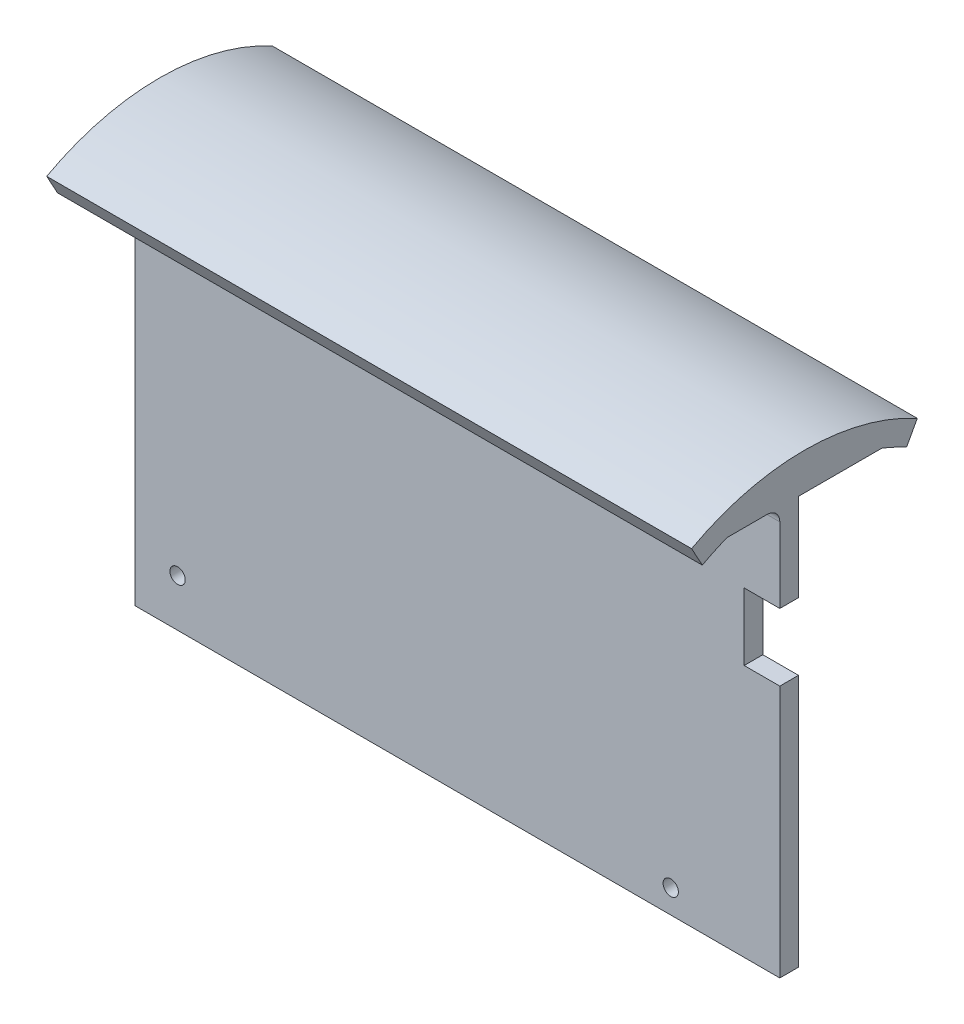
ISO-10303-21;
HEADER;
FILE_DESCRIPTION(('STEP AP214'),'2;1');
FILE_NAME('part.step','',(''),(''),'','','');
FILE_SCHEMA(('AUTOMOTIVE_DESIGN { 1 0 10303 214 1 1 1 1 }'));
ENDSEC;
DATA;
#1=APPLICATION_CONTEXT('core data for automotive mechanical design processes');
#2=APPLICATION_PROTOCOL_DEFINITION('international standard','automotive_design',2000,#1);
#3=PRODUCT_CONTEXT('',#1,'mechanical');
#4=PRODUCT('Part','Part','',(#3));
#5=PRODUCT_RELATED_PRODUCT_CATEGORY('part','',(#4));
#6=PRODUCT_DEFINITION_FORMATION('','',#4);
#7=PRODUCT_DEFINITION_CONTEXT('part definition',#1,'design');
#8=PRODUCT_DEFINITION('design','',#6,#7);
#9=PRODUCT_DEFINITION_SHAPE('','',#8);
#10=(LENGTH_UNIT() NAMED_UNIT(*) SI_UNIT(.MILLI.,.METRE.));
#11=(NAMED_UNIT(*) PLANE_ANGLE_UNIT() SI_UNIT($,.RADIAN.));
#12=(NAMED_UNIT(*) SI_UNIT($,.STERADIAN.) SOLID_ANGLE_UNIT());
#13=UNCERTAINTY_MEASURE_WITH_UNIT(LENGTH_MEASURE(1.E-05),#10,'distance_accuracy_value','');
#14=(GEOMETRIC_REPRESENTATION_CONTEXT(3) GLOBAL_UNCERTAINTY_ASSIGNED_CONTEXT((#13)) GLOBAL_UNIT_ASSIGNED_CONTEXT((#10,
#11,#12)) REPRESENTATION_CONTEXT('',''));
#15=CARTESIAN_POINT('',(0.,0.,0.));
#16=DIRECTION('',(0.,0.,1.));
#17=DIRECTION('',(1.,0.,0.));
#18=AXIS2_PLACEMENT_3D('',#15,#16,#17);
#19=CARTESIAN_POINT('',(0.,-28.0599447093199,2.5));
#20=DIRECTION('',(0.,-1.,0.));
#21=DIRECTION('',(0.,0.,-1.));
#22=AXIS2_PLACEMENT_3D('',#19,#20,#21);
#23=PLANE('',#22);
#24=DIRECTION('',(-1.,0.,0.));
#25=VECTOR('',#24,1.);
#26=CARTESIAN_POINT('',(0.,-28.0599447093199,0.));
#27=LINE('',#26,#25);
#28=CARTESIAN_POINT('',(43.18,-28.0599447093199,0.));
#29=VERTEX_POINT('',#28);
#30=CARTESIAN_POINT('',(-43.18,-28.0599447093199,0.));
#31=VERTEX_POINT('',#30);
#32=EDGE_CURVE('E338',#29,#31,#27,.T.);
#33=ORIENTED_EDGE('',*,*,#32,.F.);
#34=DIRECTION('',(0.,0.,-1.));
#35=VECTOR('',#34,1.);
#36=CARTESIAN_POINT('',(43.18,-28.0599447093199,2.5));
#37=LINE('',#36,#35);
#38=CARTESIAN_POINT('',(43.18,-28.0599447093199,2.5));
#39=VERTEX_POINT('',#38);
#40=EDGE_CURVE('E382',#39,#29,#37,.T.);
#41=ORIENTED_EDGE('',*,*,#40,.F.);
#42=DIRECTION('',(-1.,0.,0.));
#43=VECTOR('',#42,1.);
#44=CARTESIAN_POINT('',(0.,-28.0599447093199,2.5));
#45=LINE('',#44,#43);
#46=CARTESIAN_POINT('',(-43.18,-28.0599447093199,2.5));
#47=VERTEX_POINT('',#46);
#48=EDGE_CURVE('E302',#39,#47,#45,.T.);
#49=ORIENTED_EDGE('',*,*,#48,.T.);
#50=DIRECTION('',(0.,0.,-1.));
#51=VECTOR('',#50,1.);
#52=CARTESIAN_POINT('',(-43.18,-28.0599447093199,2.5));
#53=LINE('',#52,#51);
#54=EDGE_CURVE('E326',#47,#31,#53,.T.);
#55=ORIENTED_EDGE('',*,*,#54,.T.);
#56=EDGE_LOOP('',(#33,#41,#49,#55));
#57=FACE_BOUND('',#56,.T.);
#58=ADVANCED_FACE('F41',(#57),#23,.T.);
#59=CARTESIAN_POINT('',(43.18,0.,2.5));
#60=DIRECTION('',(1.,0.,0.));
#61=DIRECTION('',(0.,0.,-1.));
#62=AXIS2_PLACEMENT_3D('',#59,#60,#61);
#63=PLANE('',#62);
#64=DIRECTION('',(0.,-1.,0.));
#65=VECTOR('',#64,1.);
#66=CARTESIAN_POINT('',(43.18,0.,0.));
#67=LINE('',#66,#65);
#68=CARTESIAN_POINT('',(43.18,5.7940552906801,0.));
#69=VERTEX_POINT('',#68);
#70=EDGE_CURVE('E342',#69,#29,#67,.T.);
#71=ORIENTED_EDGE('',*,*,#70,.F.);
#72=DIRECTION('',(0.,0.,-1.));
#73=VECTOR('',#72,1.);
#74=CARTESIAN_POINT('',(43.18,5.7940552906801,2.5));
#75=LINE('',#74,#73);
#76=CARTESIAN_POINT('',(43.18,5.7940552906801,2.5));
#77=VERTEX_POINT('',#76);
#78=EDGE_CURVE('E379',#77,#69,#75,.T.);
#79=ORIENTED_EDGE('',*,*,#78,.F.);
#80=DIRECTION('',(0.,-1.,0.));
#81=VECTOR('',#80,1.);
#82=CARTESIAN_POINT('',(43.18,0.,2.5));
#83=LINE('',#82,#81);
#84=EDGE_CURVE('E306',#77,#39,#83,.T.);
#85=ORIENTED_EDGE('',*,*,#84,.T.);
#86=ORIENTED_EDGE('',*,*,#40,.T.);
#87=EDGE_LOOP('',(#71,#79,#85,#86));
#88=FACE_BOUND('',#87,.T.);
#89=ADVANCED_FACE('F516',(#88),#63,.T.);
#90=CARTESIAN_POINT('',(0.,5.7940552906801,2.5));
#91=DIRECTION('',(0.,1.,0.));
#92=DIRECTION('',(0.,0.,1.));
#93=AXIS2_PLACEMENT_3D('',#90,#91,#92);
#94=PLANE('',#93);
#95=DIRECTION('',(1.,0.,0.));
#96=VECTOR('',#95,1.);
#97=CARTESIAN_POINT('',(0.,5.7940552906801,0.));
#98=LINE('',#97,#96);
#99=CARTESIAN_POINT('',(38.4076827239981,5.7940552906801,0.));
#100=VERTEX_POINT('',#99);
#101=EDGE_CURVE('E346',#100,#69,#98,.T.);
#102=ORIENTED_EDGE('',*,*,#101,.F.);
#103=DIRECTION('',(0.,0.,-1.));
#104=VECTOR('',#103,1.);
#105=CARTESIAN_POINT('',(38.4076827239981,5.7940552906801,2.5));
#106=LINE('',#105,#104);
#107=CARTESIAN_POINT('',(38.4076827239981,5.7940552906801,2.5));
#108=VERTEX_POINT('',#107);
#109=EDGE_CURVE('E376',#108,#100,#106,.T.);
#110=ORIENTED_EDGE('',*,*,#109,.F.);
#111=DIRECTION('',(1.,0.,0.));
#112=VECTOR('',#111,1.);
#113=CARTESIAN_POINT('',(0.,5.7940552906801,2.5));
#114=LINE('',#113,#112);
#115=EDGE_CURVE('E310',#108,#77,#114,.T.);
#116=ORIENTED_EDGE('',*,*,#115,.T.);
#117=ORIENTED_EDGE('',*,*,#78,.T.);
#118=EDGE_LOOP('',(#102,#110,#116,#117));
#119=FACE_BOUND('',#118,.T.);
#120=ADVANCED_FACE('F520',(#119),#94,.T.);
#121=CARTESIAN_POINT('',(38.4076827239981,0.,2.5));
#122=DIRECTION('',(1.,0.,0.));
#123=DIRECTION('',(0.,0.,-1.));
#124=AXIS2_PLACEMENT_3D('',#121,#122,#123);
#125=PLANE('',#124);
#126=DIRECTION('',(0.,-1.,0.));
#127=VECTOR('',#126,1.);
#128=CARTESIAN_POINT('',(38.4076827239981,0.,0.));
#129=LINE('',#128,#127);
#130=CARTESIAN_POINT('',(38.4076827239981,14.7940552906801,0.));
#131=VERTEX_POINT('',#130);
#132=EDGE_CURVE('E350',#131,#100,#129,.T.);
#133=ORIENTED_EDGE('',*,*,#132,.F.);
#134=DIRECTION('',(0.,0.,-1.));
#135=VECTOR('',#134,1.);
#136=CARTESIAN_POINT('',(38.4076827239981,14.7940552906801,2.5));
#137=LINE('',#136,#135);
#138=CARTESIAN_POINT('',(38.4076827239981,14.7940552906801,2.5));
#139=VERTEX_POINT('',#138);
#140=EDGE_CURVE('E373',#139,#131,#137,.T.);
#141=ORIENTED_EDGE('',*,*,#140,.F.);
#142=DIRECTION('',(0.,-1.,0.));
#143=VECTOR('',#142,1.);
#144=CARTESIAN_POINT('',(38.4076827239981,0.,2.5));
#145=LINE('',#144,#143);
#146=EDGE_CURVE('E314',#139,#108,#145,.T.);
#147=ORIENTED_EDGE('',*,*,#146,.T.);
#148=ORIENTED_EDGE('',*,*,#109,.T.);
#149=EDGE_LOOP('',(#133,#141,#147,#148));
#150=FACE_BOUND('',#149,.T.);
#151=ADVANCED_FACE('F526',(#150),#125,.T.);
#152=CARTESIAN_POINT('',(0.,14.7940552906801,2.5));
#153=DIRECTION('',(0.,-1.,0.));
#154=DIRECTION('',(0.,0.,-1.));
#155=AXIS2_PLACEMENT_3D('',#152,#153,#154);
#156=PLANE('',#155);
#157=DIRECTION('',(-1.,0.,0.));
#158=VECTOR('',#157,1.);
#159=CARTESIAN_POINT('',(0.,14.7940552906801,0.));
#160=LINE('',#159,#158);
#161=CARTESIAN_POINT('',(43.18,14.7940552906801,0.));
#162=VERTEX_POINT('',#161);
#163=EDGE_CURVE('E354',#162,#131,#160,.T.);
#164=ORIENTED_EDGE('',*,*,#163,.F.);
#165=DIRECTION('',(0.,0.,-1.));
#166=VECTOR('',#165,1.);
#167=CARTESIAN_POINT('',(43.18,14.7940552906801,2.5));
#168=LINE('',#167,#166);
#169=CARTESIAN_POINT('',(43.18,14.7940552906801,2.5));
#170=VERTEX_POINT('',#169);
#171=EDGE_CURVE('E370',#170,#162,#168,.T.);
#172=ORIENTED_EDGE('',*,*,#171,.F.);
#173=DIRECTION('',(-1.,0.,0.));
#174=VECTOR('',#173,1.);
#175=CARTESIAN_POINT('',(0.,14.7940552906801,2.5));
#176=LINE('',#175,#174);
#177=EDGE_CURVE('E318',#170,#139,#176,.T.);
#178=ORIENTED_EDGE('',*,*,#177,.T.);
#179=ORIENTED_EDGE('',*,*,#140,.T.);
#180=EDGE_LOOP('',(#164,#172,#178,#179));
#181=FACE_BOUND('',#180,.T.);
#182=ADVANCED_FACE('F512',(#181),#156,.T.);
#183=CARTESIAN_POINT('',(43.18,0.,2.5));
#184=DIRECTION('',(-1.,0.,0.));
#185=DIRECTION('',(0.,0.,1.));
#186=AXIS2_PLACEMENT_3D('',#183,#184,#185);
#187=PLANE('',#186);
#188=DIRECTION('',(0.,1.,0.));
#189=VECTOR('',#188,1.);
#190=CARTESIAN_POINT('',(43.18,0.,0.));
#191=LINE('',#190,#189);
#192=CARTESIAN_POINT('',(43.18,26.5500552906801,0.));
#193=VERTEX_POINT('',#192);
#194=EDGE_CURVE('E358',#162,#193,#191,.T.);
#195=ORIENTED_EDGE('',*,*,#194,.T.);
#196=DIRECTION('',(0.,0.,-1.));
#197=VECTOR('',#196,1.);
#198=CARTESIAN_POINT('',(43.18,26.5500552906801,0.));
#199=LINE('',#198,#197);
#200=CARTESIAN_POINT('',(43.18,26.5500552906801,-11.1607221785853));
#201=VERTEX_POINT('',#200);
#202=EDGE_CURVE('E424',#193,#201,#199,.T.);
#203=ORIENTED_EDGE('',*,*,#202,.T.);
#204=CARTESIAN_POINT('',(43.18,0.,-0.799999999999999));
#205=DIRECTION('',(-1.,0.,0.));
#206=DIRECTION('',(0.,0.,1.));
#207=AXIS2_PLACEMENT_3D('',#204,#205,#206);
#208=CIRCLE('',#207,28.5);
#209=CARTESIAN_POINT('',(43.18,25.0057478849418,-14.4734257856153));
#210=VERTEX_POINT('',#209);
#211=EDGE_CURVE('E426',#201,#210,#208,.T.);
#212=ORIENTED_EDGE('',*,*,#211,.T.);
#213=DIRECTION('',(0.,-0.877394662629536,0.479769325811064));
#214=VECTOR('',#213,1.);
#215=CARTESIAN_POINT('',(43.18,25.0057478849418,-14.4734257856153));
#216=LINE('',#215,#214);
#217=CARTESIAN_POINT('',(43.18,27.6379318728304,-15.9127337630485));
#218=VERTEX_POINT('',#217);
#219=EDGE_CURVE('E428',#218,#210,#216,.T.);
#220=ORIENTED_EDGE('',*,*,#219,.F.);
#221=CARTESIAN_POINT('',(43.18,0.,-0.799999999999999));
#222=DIRECTION('',(-1.,0.,0.));
#223=DIRECTION('',(0.,0.,1.));
#224=AXIS2_PLACEMENT_3D('',#221,#222,#223);
#225=CIRCLE('',#224,31.5);
#226=CARTESIAN_POINT('',(43.18,27.6379318728304,14.3127337630485));
#227=VERTEX_POINT('',#226);
#228=EDGE_CURVE('E432',#227,#218,#225,.T.);
#229=ORIENTED_EDGE('',*,*,#228,.F.);
#230=DIRECTION('',(0.,-0.877394662629537,-0.479769325811062));
#231=VECTOR('',#230,1.);
#232=CARTESIAN_POINT('',(43.18,25.0057478849418,12.8734257856153));
#233=LINE('',#232,#231);
#234=CARTESIAN_POINT('',(43.18,25.0057478849418,12.8734257856153));
#235=VERTEX_POINT('',#234);
#236=EDGE_CURVE('E436',#227,#235,#233,.T.);
#237=ORIENTED_EDGE('',*,*,#236,.T.);
#238=CARTESIAN_POINT('',(43.18,0.,-0.799999999999999));
#239=DIRECTION('',(-1.,0.,0.));
#240=DIRECTION('',(0.,0.,1.));
#241=AXIS2_PLACEMENT_3D('',#238,#239,#240);
#242=CIRCLE('',#241,28.5);
#243=CARTESIAN_POINT('',(43.18,26.5500552906801,9.56072217858534));
#244=VERTEX_POINT('',#243);
#245=EDGE_CURVE('E215',#235,#244,#242,.T.);
#246=ORIENTED_EDGE('',*,*,#245,.T.);
#247=DIRECTION('',(0.,0.,-1.));
#248=VECTOR('',#247,1.);
#249=CARTESIAN_POINT('',(43.18,26.5500552906801,4.21341298725375));
#250=LINE('',#249,#248);
#251=CARTESIAN_POINT('',(43.18,26.5500552906801,4.21341298725375));
#252=VERTEX_POINT('',#251);
#253=EDGE_CURVE('E235',#244,#252,#250,.T.);
#254=ORIENTED_EDGE('',*,*,#253,.T.);
#255=CARTESIAN_POINT('',(43.18,24.8366423034263,4.21341298725375));
#256=DIRECTION('',(-1.,0.,0.));
#257=DIRECTION('',(0.,0.,1.));
#258=AXIS2_PLACEMENT_3D('',#255,#256,#257);
#259=CIRCLE('',#258,1.71341298725375);
#260=CARTESIAN_POINT('',(43.18,24.8366423034263,2.5));
#261=VERTEX_POINT('',#260);
#262=EDGE_CURVE('E167',#252,#261,#259,.T.);
#263=ORIENTED_EDGE('',*,*,#262,.T.);
#264=DIRECTION('',(0.,1.,0.));
#265=VECTOR('',#264,1.);
#266=CARTESIAN_POINT('',(43.18,0.,2.5));
#267=LINE('',#266,#265);
#268=EDGE_CURVE('E62',#170,#261,#267,.T.);
#269=ORIENTED_EDGE('',*,*,#268,.F.);
#270=ORIENTED_EDGE('',*,*,#171,.T.);
#271=EDGE_LOOP('',(#195,#203,#212,#220,#229,#237,#246,#254,#263,#269,#270));
#272=FACE_BOUND('',#271,.T.);
#273=ADVANCED_FACE('F443',(#272),#187,.F.);
#274=CARTESIAN_POINT('',(-18.3229245792443,20.4872418977798,2.5));
#275=DIRECTION('',(0.,0.,-1.));
#276=DIRECTION('',(-1.,0.,0.));
#277=AXIS2_PLACEMENT_3D('',#274,#275,#276);
#278=CYLINDRICAL_SURFACE('',#277,5.00000000000002);
#279=CARTESIAN_POINT('',(-18.3229245792443,20.4872418977798,2.5));
#280=DIRECTION('',(0.,0.,1.));
#281=DIRECTION('',(1.,0.,0.));
#282=AXIS2_PLACEMENT_3D('',#279,#280,#281);
#283=CIRCLE('',#282,5.00000000000002);
#284=CARTESIAN_POINT('',(-15.8566082752472,24.8366423034263,2.5));
#285=VERTEX_POINT('',#284);
#286=CARTESIAN_POINT('',(-20.7892408832413,24.8366423034263,2.5));
#287=VERTEX_POINT('',#286);
#288=EDGE_CURVE('E298',#285,#287,#283,.T.);
#289=ORIENTED_EDGE('',*,*,#288,.T.);
#290=EDGE_CURVE('E297',#287,#285,#283,.T.);
#291=ORIENTED_EDGE('',*,*,#290,.T.);
#292=EDGE_LOOP('',(#289,#291));
#293=FACE_BOUND('',#292,.T.);
#294=CARTESIAN_POINT('',(-18.3229245792443,20.4872418977798,0.));
#295=DIRECTION('',(0.,0.,1.));
#296=DIRECTION('',(1.,0.,0.));
#297=AXIS2_PLACEMENT_3D('',#294,#295,#296);
#298=CIRCLE('',#297,5.00000000000002);
#299=CARTESIAN_POINT('',(-13.3229245792442,20.4872418977798,0.));
#300=VERTEX_POINT('',#299);
#301=EDGE_CURVE('E334',#300,#300,#298,.T.);
#302=ORIENTED_EDGE('',*,*,#301,.F.);
#303=EDGE_LOOP('',(#302));
#304=FACE_BOUND('',#303,.T.);
#305=ADVANCED_FACE('F417',(#293,#304),#278,.F.);
#306=CARTESIAN_POINT('',(-4.22756625500798,21.4060553914884,2.5));
#307=DIRECTION('',(0.,0.,-1.));
#308=DIRECTION('',(-1.,0.,0.));
#309=AXIS2_PLACEMENT_3D('',#306,#307,#308);
#310=CYLINDRICAL_SURFACE('',#309,3.99999999999999);
#311=CARTESIAN_POINT('',(-4.22756625500798,21.4060553914884,2.5));
#312=DIRECTION('',(0.,0.,1.));
#313=DIRECTION('',(1.,0.,0.));
#314=AXIS2_PLACEMENT_3D('',#311,#312,#313);
#315=CIRCLE('',#314,3.99999999999999);
#316=CARTESIAN_POINT('',(-2.17060892933492,24.8366423034263,2.5));
#317=VERTEX_POINT('',#316);
#318=CARTESIAN_POINT('',(-6.28452358068103,24.8366423034263,2.5));
#319=VERTEX_POINT('',#318);
#320=EDGE_CURVE('E293',#317,#319,#315,.T.);
#321=ORIENTED_EDGE('',*,*,#320,.T.);
#322=EDGE_CURVE('E291',#319,#317,#315,.T.);
#323=ORIENTED_EDGE('',*,*,#322,.T.);
#324=EDGE_LOOP('',(#321,#323));
#325=FACE_BOUND('',#324,.T.);
#326=CARTESIAN_POINT('',(-4.22756625500798,21.4060553914884,0.));
#327=DIRECTION('',(0.,0.,1.));
#328=DIRECTION('',(1.,0.,0.));
#329=AXIS2_PLACEMENT_3D('',#326,#327,#328);
#330=CIRCLE('',#329,3.99999999999999);
#331=CARTESIAN_POINT('',(-0.227566255007983,21.4060553914884,0.));
#332=VERTEX_POINT('',#331);
#333=EDGE_CURVE('E330',#332,#332,#330,.T.);
#334=ORIENTED_EDGE('',*,*,#333,.F.);
#335=EDGE_LOOP('',(#334));
#336=FACE_BOUND('',#335,.T.);
#337=ADVANCED_FACE('F494',(#325,#336),#310,.F.);
#338=CARTESIAN_POINT('',(20.844433744992,18.8790553914884,2.5));
#339=DIRECTION('',(0.,0.,-1.));
#340=DIRECTION('',(-1.,0.,0.));
#341=AXIS2_PLACEMENT_3D('',#338,#339,#340);
#342=CYLINDRICAL_SURFACE('',#341,3.99999999999999);
#343=CARTESIAN_POINT('',(20.844433744992,18.8790553914884,2.5));
#344=DIRECTION('',(0.,0.,1.));
#345=DIRECTION('',(1.,0.,0.));
#346=AXIS2_PLACEMENT_3D('',#343,#344,#345);
#347=CIRCLE('',#346,3.99999999999999);
#348=CARTESIAN_POINT('',(24.844433744992,18.8790553914884,2.5));
#349=VERTEX_POINT('',#348);
#350=EDGE_CURVE('E287',#349,#349,#347,.T.);
#351=ORIENTED_EDGE('',*,*,#350,.T.);
#352=EDGE_LOOP('',(#351));
#353=FACE_BOUND('',#352,.T.);
#354=CARTESIAN_POINT('',(20.844433744992,18.8790553914884,0.));
#355=DIRECTION('',(0.,0.,1.));
#356=DIRECTION('',(1.,0.,0.));
#357=AXIS2_PLACEMENT_3D('',#354,#355,#356);
#358=CIRCLE('',#357,3.99999999999999);
#359=CARTESIAN_POINT('',(24.844433744992,18.8790553914884,0.));
#360=VERTEX_POINT('',#359);
#361=EDGE_CURVE('E286',#360,#360,#358,.T.);
#362=ORIENTED_EDGE('',*,*,#361,.F.);
#363=EDGE_LOOP('',(#362));
#364=FACE_BOUND('',#363,.T.);
#365=ADVANCED_FACE('F43',(#353,#364),#342,.F.);
#366=CARTESIAN_POINT('',(-43.18,0.,2.5));
#367=DIRECTION('',(-1.,0.,0.));
#368=DIRECTION('',(0.,0.,1.));
#369=AXIS2_PLACEMENT_3D('',#366,#367,#368);
#370=PLANE('',#369);
#371=DIRECTION('',(0.,0.,1.));
#372=VECTOR('',#371,1.);
#373=CARTESIAN_POINT('',(-43.18,26.5500552906801,0.));
#374=LINE('',#373,#372);
#375=CARTESIAN_POINT('',(-43.18,26.5500552906801,-11.1607221785853));
#376=VERTEX_POINT('',#375);
#377=CARTESIAN_POINT('',(-43.18,26.5500552906801,0.));
#378=VERTEX_POINT('',#377);
#379=EDGE_CURVE('E172',#376,#378,#374,.T.);
#380=ORIENTED_EDGE('',*,*,#379,.T.);
#381=DIRECTION('',(0.,1.,0.));
#382=VECTOR('',#381,1.);
#383=CARTESIAN_POINT('',(-43.18,0.,0.));
#384=LINE('',#383,#382);
#385=EDGE_CURVE('E292',#31,#378,#384,.T.);
#386=ORIENTED_EDGE('',*,*,#385,.F.);
#387=ORIENTED_EDGE('',*,*,#54,.F.);
#388=DIRECTION('',(0.,1.,0.));
#389=VECTOR('',#388,1.);
#390=CARTESIAN_POINT('',(-43.18,0.,2.5));
#391=LINE('',#390,#389);
#392=CARTESIAN_POINT('',(-43.18,24.8366423034263,2.5));
#393=VERTEX_POINT('',#392);
#394=EDGE_CURVE('E186',#47,#393,#391,.T.);
#395=ORIENTED_EDGE('',*,*,#394,.T.);
#396=CARTESIAN_POINT('',(-43.18,24.8366423034263,4.21341298725375));
#397=DIRECTION('',(1.,0.,0.));
#398=DIRECTION('',(0.,0.,-1.));
#399=AXIS2_PLACEMENT_3D('',#396,#397,#398);
#400=CIRCLE('',#399,1.71341298725375);
#401=CARTESIAN_POINT('',(-43.18,26.5500552906801,4.21341298725375));
#402=VERTEX_POINT('',#401);
#403=EDGE_CURVE('E165',#393,#402,#400,.T.);
#404=ORIENTED_EDGE('',*,*,#403,.T.);
#405=DIRECTION('',(0.,0.,1.));
#406=VECTOR('',#405,1.);
#407=CARTESIAN_POINT('',(-43.18,26.5500552906801,4.21341298725375));
#408=LINE('',#407,#406);
#409=CARTESIAN_POINT('',(-43.18,26.5500552906801,9.56072217858534));
#410=VERTEX_POINT('',#409);
#411=EDGE_CURVE('E175',#402,#410,#408,.T.);
#412=ORIENTED_EDGE('',*,*,#411,.T.);
#413=CARTESIAN_POINT('',(-43.18,0.,-0.799999999999999));
#414=DIRECTION('',(1.,0.,0.));
#415=DIRECTION('',(0.,0.,-1.));
#416=AXIS2_PLACEMENT_3D('',#413,#414,#415);
#417=CIRCLE('',#416,28.5);
#418=CARTESIAN_POINT('',(-43.18,25.0057478849418,12.8734257856153));
#419=VERTEX_POINT('',#418);
#420=EDGE_CURVE('E182',#410,#419,#417,.T.);
#421=ORIENTED_EDGE('',*,*,#420,.T.);
#422=DIRECTION('',(0.,0.877394662629537,0.479769325811062));
#423=VECTOR('',#422,1.);
#424=CARTESIAN_POINT('',(-43.18,25.0057478849418,12.8734257856153));
#425=LINE('',#424,#423);
#426=CARTESIAN_POINT('',(-43.18,27.6379318728304,14.3127337630485));
#427=VERTEX_POINT('',#426);
#428=EDGE_CURVE('E194',#419,#427,#425,.T.);
#429=ORIENTED_EDGE('',*,*,#428,.T.);
#430=CARTESIAN_POINT('',(-43.18,0.,-0.799999999999999));
#431=DIRECTION('',(1.,0.,0.));
#432=DIRECTION('',(0.,0.,-1.));
#433=AXIS2_PLACEMENT_3D('',#430,#431,#432);
#434=CIRCLE('',#433,31.5);
#435=CARTESIAN_POINT('',(-43.18,27.6379318728304,-15.9127337630485));
#436=VERTEX_POINT('',#435);
#437=EDGE_CURVE('E198',#436,#427,#434,.T.);
#438=ORIENTED_EDGE('',*,*,#437,.F.);
#439=DIRECTION('',(0.,0.877394662629536,-0.479769325811064));
#440=VECTOR('',#439,1.);
#441=CARTESIAN_POINT('',(-43.18,25.0057478849418,-14.4734257856153));
#442=LINE('',#441,#440);
#443=CARTESIAN_POINT('',(-43.18,25.0057478849418,-14.4734257856153));
#444=VERTEX_POINT('',#443);
#445=EDGE_CURVE('E202',#444,#436,#442,.T.);
#446=ORIENTED_EDGE('',*,*,#445,.F.);
#447=CARTESIAN_POINT('',(-43.18,0.,-0.799999999999999));
#448=DIRECTION('',(1.,0.,0.));
#449=DIRECTION('',(0.,0.,-1.));
#450=AXIS2_PLACEMENT_3D('',#447,#448,#449);
#451=CIRCLE('',#450,28.5);
#452=EDGE_CURVE('E206',#444,#376,#451,.T.);
#453=ORIENTED_EDGE('',*,*,#452,.T.);
#454=EDGE_LOOP('',(#380,#386,#387,#395,#404,#412,#421,#429,#438,#446,#453));
#455=FACE_BOUND('',#454,.T.);
#456=ADVANCED_FACE('F185',(#455),#370,.T.);
#457=CARTESIAN_POINT('',(0.,0.,2.5));
#458=DIRECTION('',(0.,0.,1.));
#459=DIRECTION('',(1.,0.,0.));
#460=AXIS2_PLACEMENT_3D('',#457,#458,#459);
#461=PLANE('',#460);
#462=DIRECTION('',(-1.,0.,0.));
#463=VECTOR('',#462,1.);
#464=CARTESIAN_POINT('',(74.1312394414768,24.8366423034263,2.5));
#465=LINE('',#464,#463);
#466=EDGE_CURVE('E11',#393,#287,#465,.F.);
#467=ORIENTED_EDGE('',*,*,#466,.F.);
#468=ORIENTED_EDGE('',*,*,#394,.F.);
#469=ORIENTED_EDGE('',*,*,#48,.F.);
#470=ORIENTED_EDGE('',*,*,#84,.F.);
#471=ORIENTED_EDGE('',*,*,#115,.F.);
#472=ORIENTED_EDGE('',*,*,#146,.F.);
#473=ORIENTED_EDGE('',*,*,#177,.F.);
#474=ORIENTED_EDGE('',*,*,#268,.T.);
#475=DIRECTION('',(-1.,0.,0.));
#476=VECTOR('',#475,1.);
#477=CARTESIAN_POINT('',(74.1312394414768,24.8366423034263,2.5));
#478=LINE('',#477,#476);
#479=EDGE_CURVE('E212',#261,#317,#478,.T.);
#480=ORIENTED_EDGE('',*,*,#479,.T.);
#481=ORIENTED_EDGE('',*,*,#322,.F.);
#482=EDGE_CURVE('E50',#285,#319,#465,.F.);
#483=ORIENTED_EDGE('',*,*,#482,.F.);
#484=ORIENTED_EDGE('',*,*,#290,.F.);
#485=EDGE_LOOP('',(#467,#468,#469,#470,#471,#472,#473,#474,#480,#481,#483,#484));
#486=FACE_BOUND('',#485,.T.);
#487=CARTESIAN_POINT('',(28.575,23.3750552906801,2.5));
#488=DIRECTION('',(0.,0.,-1.));
#489=DIRECTION('',(-1.,0.,0.));
#490=AXIS2_PLACEMENT_3D('',#487,#488,#489);
#491=CIRCLE('',#490,1.025);
#492=CARTESIAN_POINT('',(27.55,23.3750552906801,2.5));
#493=VERTEX_POINT('',#492);
#494=EDGE_CURVE('E242',#493,#493,#491,.T.);
#495=ORIENTED_EDGE('',*,*,#494,.T.);
#496=EDGE_LOOP('',(#495));
#497=FACE_BOUND('',#496,.T.);
#498=CARTESIAN_POINT('',(-37.465,20.2000552906801,2.5));
#499=DIRECTION('',(0.,0.,-1.));
#500=DIRECTION('',(-1.,0.,0.));
#501=AXIS2_PLACEMENT_3D('',#498,#499,#500);
#502=CIRCLE('',#501,1.025);
#503=CARTESIAN_POINT('',(-38.49,20.2000552906801,2.5));
#504=VERTEX_POINT('',#503);
#505=EDGE_CURVE('E250',#504,#504,#502,.T.);
#506=ORIENTED_EDGE('',*,*,#505,.T.);
#507=EDGE_LOOP('',(#506));
#508=FACE_BOUND('',#507,.T.);
#509=CARTESIAN_POINT('',(28.575,-24.8849447093199,2.5));
#510=DIRECTION('',(0.,0.,-1.));
#511=DIRECTION('',(-1.,0.,0.));
#512=AXIS2_PLACEMENT_3D('',#509,#510,#511);
#513=CIRCLE('',#512,1.025);
#514=CARTESIAN_POINT('',(27.55,-24.8849447093199,2.5));
#515=VERTEX_POINT('',#514);
#516=EDGE_CURVE('E258',#515,#515,#513,.T.);
#517=ORIENTED_EDGE('',*,*,#516,.T.);
#518=EDGE_LOOP('',(#517));
#519=FACE_BOUND('',#518,.T.);
#520=CARTESIAN_POINT('',(-37.465,-21.7099447093199,2.5));
#521=DIRECTION('',(0.,0.,-1.));
#522=DIRECTION('',(-1.,0.,0.));
#523=AXIS2_PLACEMENT_3D('',#520,#521,#522);
#524=CIRCLE('',#523,1.025);
#525=CARTESIAN_POINT('',(-38.49,-21.7099447093199,2.5));
#526=VERTEX_POINT('',#525);
#527=EDGE_CURVE('E266',#526,#526,#524,.T.);
#528=ORIENTED_EDGE('',*,*,#527,.T.);
#529=EDGE_LOOP('',(#528));
#530=FACE_BOUND('',#529,.T.);
#531=ORIENTED_EDGE('',*,*,#350,.F.);
#532=EDGE_LOOP('',(#531));
#533=FACE_BOUND('',#532,.T.);
#534=ADVANCED_FACE('F478',(#486,#497,#508,#519,#530,#533),#461,.T.);
#535=CARTESIAN_POINT('',(0.,0.,0.));
#536=DIRECTION('',(0.,0.,1.));
#537=DIRECTION('',(1.,0.,0.));
#538=AXIS2_PLACEMENT_3D('',#535,#536,#537);
#539=PLANE('',#538);
#540=CARTESIAN_POINT('',(28.575,-24.8849447093199,0.));
#541=DIRECTION('',(0.,0.,1.));
#542=DIRECTION('',(1.,0.,0.));
#543=AXIS2_PLACEMENT_3D('',#540,#541,#542);
#544=CIRCLE('',#543,3.0875);
#545=CARTESIAN_POINT('',(31.6625,-24.8849447093199,0.));
#546=VERTEX_POINT('',#545);
#547=EDGE_CURVE('E396',#546,#546,#544,.F.);
#548=ORIENTED_EDGE('',*,*,#547,.F.);
#549=EDGE_LOOP('',(#548));
#550=FACE_BOUND('',#549,.T.);
#551=CARTESIAN_POINT('',(28.575,23.3750552906801,0.));
#552=DIRECTION('',(0.,0.,1.));
#553=DIRECTION('',(1.,0.,0.));
#554=AXIS2_PLACEMENT_3D('',#551,#552,#553);
#555=CIRCLE('',#554,3.0875);
#556=CARTESIAN_POINT('',(31.6625,23.3750552906801,0.));
#557=VERTEX_POINT('',#556);
#558=EDGE_CURVE('E393',#557,#557,#555,.F.);
#559=ORIENTED_EDGE('',*,*,#558,.F.);
#560=EDGE_LOOP('',(#559));
#561=FACE_BOUND('',#560,.T.);
#562=CARTESIAN_POINT('',(-37.465,20.2000552906801,0.));
#563=DIRECTION('',(0.,0.,1.));
#564=DIRECTION('',(1.,0.,0.));
#565=AXIS2_PLACEMENT_3D('',#562,#563,#564);
#566=CIRCLE('',#565,3.08749999999999);
#567=CARTESIAN_POINT('',(-34.3775,20.2000552906801,0.));
#568=VERTEX_POINT('',#567);
#569=EDGE_CURVE('E389',#568,#568,#566,.F.);
#570=ORIENTED_EDGE('',*,*,#569,.F.);
#571=EDGE_LOOP('',(#570));
#572=FACE_BOUND('',#571,.T.);
#573=CARTESIAN_POINT('',(-37.465,-21.7099447093199,0.));
#574=DIRECTION('',(0.,0.,1.));
#575=DIRECTION('',(1.,0.,0.));
#576=AXIS2_PLACEMENT_3D('',#573,#574,#575);
#577=CIRCLE('',#576,3.08749999999999);
#578=CARTESIAN_POINT('',(-34.3775,-21.7099447093199,0.));
#579=VERTEX_POINT('',#578);
#580=EDGE_CURVE('E385',#579,#579,#577,.F.);
#581=ORIENTED_EDGE('',*,*,#580,.F.);
#582=EDGE_LOOP('',(#581));
#583=FACE_BOUND('',#582,.T.);
#584=ORIENTED_EDGE('',*,*,#361,.T.);
#585=EDGE_LOOP('',(#584));
#586=FACE_BOUND('',#585,.T.);
#587=ORIENTED_EDGE('',*,*,#333,.T.);
#588=EDGE_LOOP('',(#587));
#589=FACE_BOUND('',#588,.T.);
#590=ORIENTED_EDGE('',*,*,#301,.T.);
#591=EDGE_LOOP('',(#590));
#592=FACE_BOUND('',#591,.T.);
#593=ORIENTED_EDGE('',*,*,#32,.T.);
#594=ORIENTED_EDGE('',*,*,#385,.T.);
#595=DIRECTION('',(-1.,0.,0.));
#596=VECTOR('',#595,1.);
#597=CARTESIAN_POINT('',(0.,26.5500552906801,0.));
#598=LINE('',#597,#596);
#599=EDGE_CURVE('E362',#193,#378,#598,.T.);
#600=ORIENTED_EDGE('',*,*,#599,.F.);
#601=ORIENTED_EDGE('',*,*,#194,.F.);
#602=ORIENTED_EDGE('',*,*,#163,.T.);
#603=ORIENTED_EDGE('',*,*,#132,.T.);
#604=ORIENTED_EDGE('',*,*,#101,.T.);
#605=ORIENTED_EDGE('',*,*,#70,.T.);
#606=EDGE_LOOP('',(#593,#594,#600,#601,#602,#603,#604,#605));
#607=FACE_BOUND('',#606,.T.);
#608=ADVANCED_FACE('F471',(#550,#561,#572,#583,#586,#589,#592,#607),#539,.F.);
#609=CARTESIAN_POINT('',(-37.465,-21.7099447093199,-2.5));
#610=DIRECTION('',(0.,0.,1.));
#611=DIRECTION('',(1.,0.,0.));
#612=AXIS2_PLACEMENT_3D('',#609,#610,#611);
#613=CYLINDRICAL_SURFACE('',#612,3.08749999999999);
#614=CARTESIAN_POINT('',(-37.465,-21.7099447093199,-2.5));
#615=DIRECTION('',(0.,0.,-1.));
#616=DIRECTION('',(-1.,0.,0.));
#617=AXIS2_PLACEMENT_3D('',#614,#615,#616);
#618=CIRCLE('',#617,3.08749999999999);
#619=CARTESIAN_POINT('',(-40.5525,-21.7099447093199,-2.5));
#620=VERTEX_POINT('',#619);
#621=EDGE_CURVE('E282',#620,#620,#618,.T.);
#622=ORIENTED_EDGE('',*,*,#621,.F.);
#623=EDGE_LOOP('',(#622));
#624=FACE_BOUND('',#623,.T.);
#625=ORIENTED_EDGE('',*,*,#580,.T.);
#626=EDGE_LOOP('',(#625));
#627=FACE_BOUND('',#626,.T.);
#628=ADVANCED_FACE('F499',(#624,#627),#613,.T.);
#629=CARTESIAN_POINT('',(-37.465,-21.7099447093199,-2.5));
#630=DIRECTION('',(0.,0.,-1.));
#631=DIRECTION('',(-1.,0.,0.));
#632=AXIS2_PLACEMENT_3D('',#629,#630,#631);
#633=PLANE('',#632);
#634=CARTESIAN_POINT('',(-37.465,-21.7099447093199,-2.5));
#635=DIRECTION('',(0.,0.,-1.));
#636=DIRECTION('',(-1.,0.,0.));
#637=AXIS2_PLACEMENT_3D('',#634,#635,#636);
#638=CIRCLE('',#637,1.025);
#639=CARTESIAN_POINT('',(-38.49,-21.7099447093199,-2.5));
#640=VERTEX_POINT('',#639);
#641=EDGE_CURVE('E262',#640,#640,#638,.T.);
#642=ORIENTED_EDGE('',*,*,#641,.F.);
#643=EDGE_LOOP('',(#642));
#644=FACE_BOUND('',#643,.T.);
#645=ORIENTED_EDGE('',*,*,#621,.T.);
#646=EDGE_LOOP('',(#645));
#647=FACE_BOUND('',#646,.T.);
#648=ADVANCED_FACE('F538',(#644,#647),#633,.T.);
#649=CARTESIAN_POINT('',(-37.465,20.2000552906801,-2.5));
#650=DIRECTION('',(0.,0.,1.));
#651=DIRECTION('',(1.,0.,0.));
#652=AXIS2_PLACEMENT_3D('',#649,#650,#651);
#653=CYLINDRICAL_SURFACE('',#652,3.08749999999999);
#654=CARTESIAN_POINT('',(-37.465,20.2000552906801,-2.5));
#655=DIRECTION('',(0.,0.,-1.));
#656=DIRECTION('',(-1.,0.,0.));
#657=AXIS2_PLACEMENT_3D('',#654,#655,#656);
#658=CIRCLE('',#657,3.08749999999999);
#659=CARTESIAN_POINT('',(-40.5525,20.2000552906801,-2.5));
#660=VERTEX_POINT('',#659);
#661=EDGE_CURVE('E278',#660,#660,#658,.T.);
#662=ORIENTED_EDGE('',*,*,#661,.F.);
#663=EDGE_LOOP('',(#662));
#664=FACE_BOUND('',#663,.T.);
#665=ORIENTED_EDGE('',*,*,#569,.T.);
#666=EDGE_LOOP('',(#665));
#667=FACE_BOUND('',#666,.T.);
#668=ADVANCED_FACE('F542',(#664,#667),#653,.T.);
#669=CARTESIAN_POINT('',(-37.465,20.2000552906801,-2.5));
#670=DIRECTION('',(0.,0.,-1.));
#671=DIRECTION('',(-1.,0.,0.));
#672=AXIS2_PLACEMENT_3D('',#669,#670,#671);
#673=PLANE('',#672);
#674=CARTESIAN_POINT('',(-37.465,20.2000552906801,-2.5));
#675=DIRECTION('',(0.,0.,-1.));
#676=DIRECTION('',(-1.,0.,0.));
#677=AXIS2_PLACEMENT_3D('',#674,#675,#676);
#678=CIRCLE('',#677,1.025);
#679=CARTESIAN_POINT('',(-38.49,20.2000552906801,-2.5));
#680=VERTEX_POINT('',#679);
#681=EDGE_CURVE('E246',#680,#680,#678,.T.);
#682=ORIENTED_EDGE('',*,*,#681,.F.);
#683=EDGE_LOOP('',(#682));
#684=FACE_BOUND('',#683,.T.);
#685=ORIENTED_EDGE('',*,*,#661,.T.);
#686=EDGE_LOOP('',(#685));
#687=FACE_BOUND('',#686,.T.);
#688=ADVANCED_FACE('F546',(#684,#687),#673,.T.);
#689=CARTESIAN_POINT('',(28.575,23.3750552906801,-2.5));
#690=DIRECTION('',(0.,0.,1.));
#691=DIRECTION('',(1.,0.,0.));
#692=AXIS2_PLACEMENT_3D('',#689,#690,#691);
#693=CYLINDRICAL_SURFACE('',#692,3.0875);
#694=CARTESIAN_POINT('',(28.575,23.3750552906801,-2.5));
#695=DIRECTION('',(0.,0.,-1.));
#696=DIRECTION('',(-1.,0.,0.));
#697=AXIS2_PLACEMENT_3D('',#694,#695,#696);
#698=CIRCLE('',#697,3.0875);
#699=CARTESIAN_POINT('',(25.4875,23.3750552906801,-2.5));
#700=VERTEX_POINT('',#699);
#701=EDGE_CURVE('E274',#700,#700,#698,.T.);
#702=ORIENTED_EDGE('',*,*,#701,.F.);
#703=EDGE_LOOP('',(#702));
#704=FACE_BOUND('',#703,.T.);
#705=ORIENTED_EDGE('',*,*,#558,.T.);
#706=EDGE_LOOP('',(#705));
#707=FACE_BOUND('',#706,.T.);
#708=ADVANCED_FACE('F550',(#704,#707),#693,.T.);
#709=CARTESIAN_POINT('',(28.575,23.3750552906801,-2.5));
#710=DIRECTION('',(0.,0.,-1.));
#711=DIRECTION('',(-1.,0.,0.));
#712=AXIS2_PLACEMENT_3D('',#709,#710,#711);
#713=PLANE('',#712);
#714=CARTESIAN_POINT('',(28.575,23.3750552906801,-2.5));
#715=DIRECTION('',(0.,0.,-1.));
#716=DIRECTION('',(-1.,0.,0.));
#717=AXIS2_PLACEMENT_3D('',#714,#715,#716);
#718=CIRCLE('',#717,1.025);
#719=CARTESIAN_POINT('',(27.55,23.3750552906801,-2.5));
#720=VERTEX_POINT('',#719);
#721=EDGE_CURVE('E238',#720,#720,#718,.T.);
#722=ORIENTED_EDGE('',*,*,#721,.F.);
#723=EDGE_LOOP('',(#722));
#724=FACE_BOUND('',#723,.T.);
#725=ORIENTED_EDGE('',*,*,#701,.T.);
#726=EDGE_LOOP('',(#725));
#727=FACE_BOUND('',#726,.T.);
#728=ADVANCED_FACE('F554',(#724,#727),#713,.T.);
#729=CARTESIAN_POINT('',(28.575,-24.8849447093199,-2.5));
#730=DIRECTION('',(0.,0.,1.));
#731=DIRECTION('',(1.,0.,0.));
#732=AXIS2_PLACEMENT_3D('',#729,#730,#731);
#733=CYLINDRICAL_SURFACE('',#732,3.0875);
#734=CARTESIAN_POINT('',(28.575,-24.8849447093199,-2.5));
#735=DIRECTION('',(0.,0.,-1.));
#736=DIRECTION('',(-1.,0.,0.));
#737=AXIS2_PLACEMENT_3D('',#734,#735,#736);
#738=CIRCLE('',#737,3.0875);
#739=CARTESIAN_POINT('',(25.4875,-24.8849447093199,-2.5));
#740=VERTEX_POINT('',#739);
#741=EDGE_CURVE('E270',#740,#740,#738,.T.);
#742=ORIENTED_EDGE('',*,*,#741,.F.);
#743=EDGE_LOOP('',(#742));
#744=FACE_BOUND('',#743,.T.);
#745=ORIENTED_EDGE('',*,*,#547,.T.);
#746=EDGE_LOOP('',(#745));
#747=FACE_BOUND('',#746,.T.);
#748=ADVANCED_FACE('F558',(#744,#747),#733,.T.);
#749=CARTESIAN_POINT('',(28.575,-24.8849447093199,-2.5));
#750=DIRECTION('',(0.,0.,-1.));
#751=DIRECTION('',(-1.,0.,0.));
#752=AXIS2_PLACEMENT_3D('',#749,#750,#751);
#753=PLANE('',#752);
#754=CARTESIAN_POINT('',(28.575,-24.8849447093199,-2.5));
#755=DIRECTION('',(0.,0.,-1.));
#756=DIRECTION('',(-1.,0.,0.));
#757=AXIS2_PLACEMENT_3D('',#754,#755,#756);
#758=CIRCLE('',#757,1.025);
#759=CARTESIAN_POINT('',(27.55,-24.8849447093199,-2.5));
#760=VERTEX_POINT('',#759);
#761=EDGE_CURVE('E254',#760,#760,#758,.T.);
#762=ORIENTED_EDGE('',*,*,#761,.F.);
#763=EDGE_LOOP('',(#762));
#764=FACE_BOUND('',#763,.T.);
#765=ORIENTED_EDGE('',*,*,#741,.T.);
#766=EDGE_LOOP('',(#765));
#767=FACE_BOUND('',#766,.T.);
#768=ADVANCED_FACE('F562',(#764,#767),#753,.T.);
#769=CARTESIAN_POINT('',(-37.465,-21.7099447093199,-2.5));
#770=DIRECTION('',(0.,0.,-1.));
#771=DIRECTION('',(-1.,0.,0.));
#772=AXIS2_PLACEMENT_3D('',#769,#770,#771);
#773=CYLINDRICAL_SURFACE('',#772,1.025);
#774=ORIENTED_EDGE('',*,*,#527,.F.);
#775=EDGE_LOOP('',(#774));
#776=FACE_BOUND('',#775,.T.);
#777=ORIENTED_EDGE('',*,*,#641,.T.);
#778=EDGE_LOOP('',(#777));
#779=FACE_BOUND('',#778,.T.);
#780=ADVANCED_FACE('F566',(#776,#779),#773,.F.);
#781=CARTESIAN_POINT('',(28.575,-24.8849447093199,-2.5));
#782=DIRECTION('',(0.,0.,-1.));
#783=DIRECTION('',(-1.,0.,0.));
#784=AXIS2_PLACEMENT_3D('',#781,#782,#783);
#785=CYLINDRICAL_SURFACE('',#784,1.025);
#786=ORIENTED_EDGE('',*,*,#516,.F.);
#787=EDGE_LOOP('',(#786));
#788=FACE_BOUND('',#787,.T.);
#789=ORIENTED_EDGE('',*,*,#761,.T.);
#790=EDGE_LOOP('',(#789));
#791=FACE_BOUND('',#790,.T.);
#792=ADVANCED_FACE('F570',(#788,#791),#785,.F.);
#793=CARTESIAN_POINT('',(-37.465,20.2000552906801,-2.5));
#794=DIRECTION('',(0.,0.,-1.));
#795=DIRECTION('',(-1.,0.,0.));
#796=AXIS2_PLACEMENT_3D('',#793,#794,#795);
#797=CYLINDRICAL_SURFACE('',#796,1.025);
#798=ORIENTED_EDGE('',*,*,#505,.F.);
#799=EDGE_LOOP('',(#798));
#800=FACE_BOUND('',#799,.T.);
#801=ORIENTED_EDGE('',*,*,#681,.T.);
#802=EDGE_LOOP('',(#801));
#803=FACE_BOUND('',#802,.T.);
#804=ADVANCED_FACE('F574',(#800,#803),#797,.F.);
#805=CARTESIAN_POINT('',(28.575,23.3750552906801,-2.5));
#806=DIRECTION('',(0.,0.,-1.));
#807=DIRECTION('',(-1.,0.,0.));
#808=AXIS2_PLACEMENT_3D('',#805,#806,#807);
#809=CYLINDRICAL_SURFACE('',#808,1.025);
#810=ORIENTED_EDGE('',*,*,#494,.F.);
#811=EDGE_LOOP('',(#810));
#812=FACE_BOUND('',#811,.T.);
#813=ORIENTED_EDGE('',*,*,#721,.T.);
#814=EDGE_LOOP('',(#813));
#815=FACE_BOUND('',#814,.T.);
#816=ADVANCED_FACE('F578',(#812,#815),#809,.F.);
#817=CARTESIAN_POINT('',(74.1312394414768,24.8366423034263,2.5));
#818=DIRECTION('',(0.,0.,1.));
#819=DIRECTION('',(1.,0.,0.));
#820=AXIS2_PLACEMENT_3D('',#817,#818,#819);
#821=PLANE('',#820);
#822=ORIENTED_EDGE('',*,*,#288,.F.);
#823=EDGE_CURVE('E217',#285,#287,#478,.T.);
#824=ORIENTED_EDGE('',*,*,#823,.T.);
#825=EDGE_LOOP('',(#822,#824));
#826=FACE_BOUND('',#825,.T.);
#827=ADVANCED_FACE('F415',(#826),#821,.F.);
#828=CARTESIAN_POINT('',(74.1312394414768,26.5500552906801,0.));
#829=DIRECTION('',(0.,-1.,0.));
#830=DIRECTION('',(0.,0.,-1.));
#831=AXIS2_PLACEMENT_3D('',#828,#829,#830);
#832=PLANE('',#831);
#833=ORIENTED_EDGE('',*,*,#599,.T.);
#834=ORIENTED_EDGE('',*,*,#379,.F.);
#835=DIRECTION('',(-1.,0.,0.));
#836=VECTOR('',#835,1.);
#837=CARTESIAN_POINT('',(74.1312394414768,26.5500552906801,-11.1607221785853));
#838=LINE('',#837,#836);
#839=EDGE_CURVE('E218',#201,#376,#838,.T.);
#840=ORIENTED_EDGE('',*,*,#839,.F.);
#841=ORIENTED_EDGE('',*,*,#202,.F.);
#842=EDGE_LOOP('',(#833,#834,#840,#841));
#843=FACE_BOUND('',#842,.T.);
#844=ADVANCED_FACE('F468',(#843),#832,.T.);
#845=CARTESIAN_POINT('',(74.1312394414768,24.8366423034263,4.21341298725375));
#846=DIRECTION('',(-1.,0.,0.));
#847=DIRECTION('',(0.,0.,1.));
#848=AXIS2_PLACEMENT_3D('',#845,#846,#847);
#849=CYLINDRICAL_SURFACE('',#848,1.71341298725375);
#850=ORIENTED_EDGE('',*,*,#262,.F.);
#851=DIRECTION('',(-1.,0.,0.));
#852=VECTOR('',#851,1.);
#853=CARTESIAN_POINT('',(74.1312394414768,26.5500552906801,4.21341298725375));
#854=LINE('',#853,#852);
#855=EDGE_CURVE('E161',#252,#402,#854,.T.);
#856=ORIENTED_EDGE('',*,*,#855,.T.);
#857=ORIENTED_EDGE('',*,*,#403,.F.);
#858=ORIENTED_EDGE('',*,*,#466,.T.);
#859=ORIENTED_EDGE('',*,*,#823,.F.);
#860=ORIENTED_EDGE('',*,*,#482,.T.);
#861=EDGE_CURVE('E216',#317,#319,#478,.T.);
#862=ORIENTED_EDGE('',*,*,#861,.F.);
#863=ORIENTED_EDGE('',*,*,#479,.F.);
#864=EDGE_LOOP('',(#850,#856,#857,#858,#859,#860,#862,#863));
#865=FACE_BOUND('',#864,.T.);
#866=ADVANCED_FACE('F163',(#865),#849,.F.);
#867=ORIENTED_EDGE('',*,*,#320,.F.);
#868=ORIENTED_EDGE('',*,*,#861,.T.);
#869=EDGE_LOOP('',(#867,#868));
#870=FACE_BOUND('',#869,.T.);
#871=ADVANCED_FACE('F410',(#870),#821,.F.);
#872=CARTESIAN_POINT('',(74.1312394414768,0.,-0.799999999999999));
#873=DIRECTION('',(-1.,0.,0.));
#874=DIRECTION('',(0.,0.,1.));
#875=AXIS2_PLACEMENT_3D('',#872,#873,#874);
#876=CYLINDRICAL_SURFACE('',#875,28.5);
#877=ORIENTED_EDGE('',*,*,#211,.F.);
#878=ORIENTED_EDGE('',*,*,#839,.T.);
#879=ORIENTED_EDGE('',*,*,#452,.F.);
#880=DIRECTION('',(-1.,0.,0.));
#881=VECTOR('',#880,1.);
#882=CARTESIAN_POINT('',(74.1312394414768,25.0057478849418,-14.4734257856153));
#883=LINE('',#882,#881);
#884=EDGE_CURVE('E221',#210,#444,#883,.T.);
#885=ORIENTED_EDGE('',*,*,#884,.F.);
#886=EDGE_LOOP('',(#877,#878,#879,#885));
#887=FACE_BOUND('',#886,.T.);
#888=ADVANCED_FACE('F463',(#887),#876,.F.);
#889=CARTESIAN_POINT('',(74.1312394414768,25.0057478849418,-14.4734257856153));
#890=DIRECTION('',(0.,0.479769325811064,0.877394662629536));
#891=DIRECTION('',(0.,-0.877394662629536,0.479769325811064));
#892=AXIS2_PLACEMENT_3D('',#889,#890,#891);
#893=PLANE('',#892);
#894=DIRECTION('',(-1.,0.,0.));
#895=VECTOR('',#894,1.);
#896=CARTESIAN_POINT('',(74.1312394414768,27.6379318728304,-15.9127337630485));
#897=LINE('',#896,#895);
#898=EDGE_CURVE('E224',#218,#436,#897,.T.);
#899=ORIENTED_EDGE('',*,*,#898,.F.);
#900=ORIENTED_EDGE('',*,*,#219,.T.);
#901=ORIENTED_EDGE('',*,*,#884,.T.);
#902=ORIENTED_EDGE('',*,*,#445,.T.);
#903=EDGE_LOOP('',(#899,#900,#901,#902));
#904=FACE_BOUND('',#903,.T.);
#905=ADVANCED_FACE('F458',(#904),#893,.F.);
#906=CARTESIAN_POINT('',(74.1312394414768,0.,-0.799999999999999));
#907=DIRECTION('',(-1.,0.,0.));
#908=DIRECTION('',(0.,0.,1.));
#909=AXIS2_PLACEMENT_3D('',#906,#907,#908);
#910=CYLINDRICAL_SURFACE('',#909,31.5);
#911=DIRECTION('',(-1.,0.,0.));
#912=VECTOR('',#911,1.);
#913=CARTESIAN_POINT('',(74.1312394414768,27.6379318728304,14.3127337630485));
#914=LINE('',#913,#912);
#915=EDGE_CURVE('E227',#227,#427,#914,.T.);
#916=ORIENTED_EDGE('',*,*,#915,.F.);
#917=ORIENTED_EDGE('',*,*,#228,.T.);
#918=ORIENTED_EDGE('',*,*,#898,.T.);
#919=ORIENTED_EDGE('',*,*,#437,.T.);
#920=EDGE_LOOP('',(#916,#917,#918,#919));
#921=FACE_BOUND('',#920,.T.);
#922=ADVANCED_FACE('F455',(#921),#910,.T.);
#923=CARTESIAN_POINT('',(74.1312394414768,25.0057478849418,12.8734257856153));
#924=DIRECTION('',(0.,-0.479769325811062,0.877394662629537));
#925=DIRECTION('',(0.,-0.877394662629537,-0.479769325811062));
#926=AXIS2_PLACEMENT_3D('',#923,#924,#925);
#927=PLANE('',#926);
#928=ORIENTED_EDGE('',*,*,#236,.F.);
#929=ORIENTED_EDGE('',*,*,#915,.T.);
#930=ORIENTED_EDGE('',*,*,#428,.F.);
#931=DIRECTION('',(-1.,0.,0.));
#932=VECTOR('',#931,1.);
#933=CARTESIAN_POINT('',(74.1312394414768,25.0057478849418,12.8734257856153));
#934=LINE('',#933,#932);
#935=EDGE_CURVE('E230',#235,#419,#934,.T.);
#936=ORIENTED_EDGE('',*,*,#935,.F.);
#937=EDGE_LOOP('',(#928,#929,#930,#936));
#938=FACE_BOUND('',#937,.T.);
#939=ADVANCED_FACE('F452',(#938),#927,.T.);
#940=CARTESIAN_POINT('',(74.1312394414768,0.,-0.799999999999999));
#941=DIRECTION('',(-1.,0.,0.));
#942=DIRECTION('',(0.,0.,1.));
#943=AXIS2_PLACEMENT_3D('',#940,#941,#942);
#944=CYLINDRICAL_SURFACE('',#943,28.5);
#945=ORIENTED_EDGE('',*,*,#245,.F.);
#946=ORIENTED_EDGE('',*,*,#935,.T.);
#947=ORIENTED_EDGE('',*,*,#420,.F.);
#948=DIRECTION('',(-1.,0.,0.));
#949=VECTOR('',#948,1.);
#950=CARTESIAN_POINT('',(74.1312394414768,26.5500552906801,9.56072217858534));
#951=LINE('',#950,#949);
#952=EDGE_CURVE('E171',#244,#410,#951,.T.);
#953=ORIENTED_EDGE('',*,*,#952,.F.);
#954=EDGE_LOOP('',(#945,#946,#947,#953));
#955=FACE_BOUND('',#954,.T.);
#956=ADVANCED_FACE('F447',(#955),#944,.F.);
#957=CARTESIAN_POINT('',(74.1312394414768,26.5500552906801,4.21341298725375));
#958=DIRECTION('',(0.,-1.,0.));
#959=DIRECTION('',(0.,0.,-1.));
#960=AXIS2_PLACEMENT_3D('',#957,#958,#959);
#961=PLANE('',#960);
#962=ORIENTED_EDGE('',*,*,#253,.F.);
#963=ORIENTED_EDGE('',*,*,#952,.T.);
#964=ORIENTED_EDGE('',*,*,#411,.F.);
#965=ORIENTED_EDGE('',*,*,#855,.F.);
#966=EDGE_LOOP('',(#962,#963,#964,#965));
#967=FACE_BOUND('',#966,.T.);
#968=ADVANCED_FACE('F176',(#967),#961,.T.);
#969=CLOSED_SHELL('',(#58,#89,#120,#151,#182,#273,#305,#337,#365,#456,#534,#608,#628,#648,#668,
#688,#708,#728,#748,#768,#780,#792,#804,#816,#827,#844,#866,#871,#888,#905,#922,#939,#956,#968));
#970=MANIFOLD_SOLID_BREP('B2',#969);
#971=ADVANCED_BREP_SHAPE_REPRESENTATION('',(#18,#970),#14);
#972=SHAPE_DEFINITION_REPRESENTATION(#9,#971);
ENDSEC;
END-ISO-10303-21;
